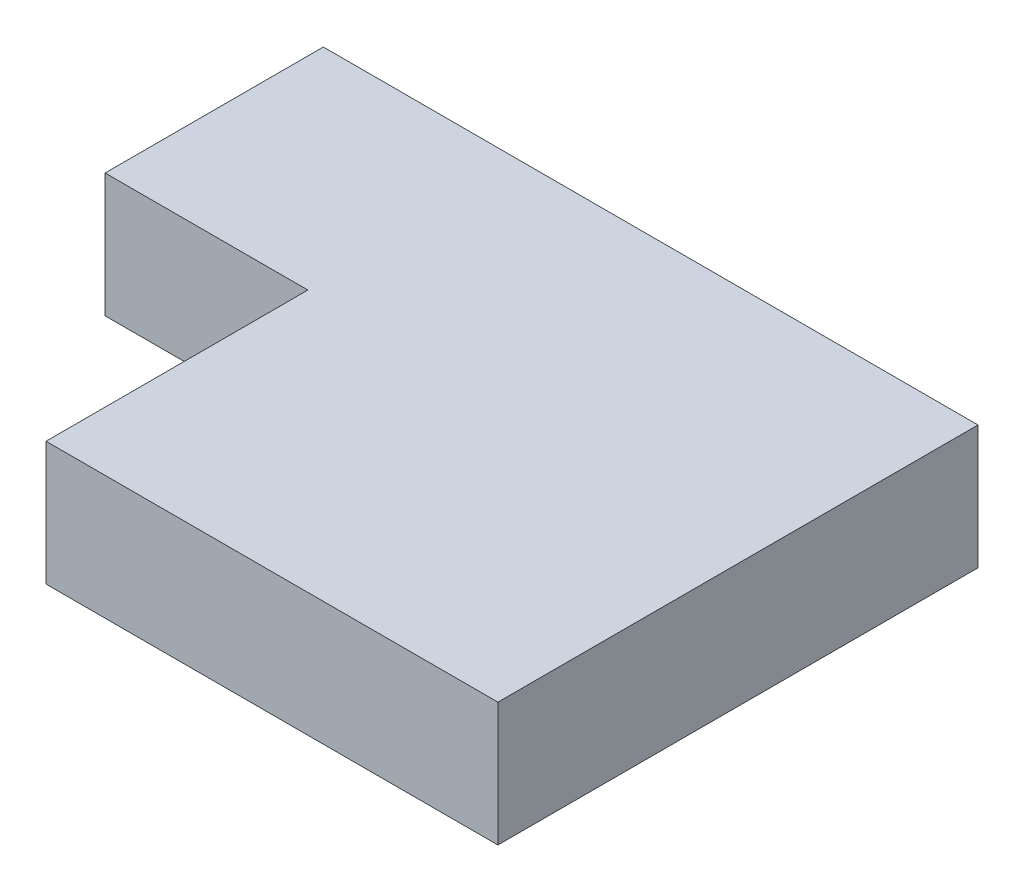
ISO-10303-21;
HEADER;
FILE_DESCRIPTION(('STEP AP214'),'2;1');
FILE_NAME('part.step','',(''),(''),'','','');
FILE_SCHEMA(('AUTOMOTIVE_DESIGN { 1 0 10303 214 1 1 1 1 }'));
ENDSEC;
DATA;
#1=APPLICATION_CONTEXT('core data for automotive mechanical design processes');
#2=APPLICATION_PROTOCOL_DEFINITION('international standard','automotive_design',2000,#1);
#3=PRODUCT_CONTEXT('',#1,'mechanical');
#4=PRODUCT('Part','Part','',(#3));
#5=PRODUCT_RELATED_PRODUCT_CATEGORY('part','',(#4));
#6=PRODUCT_DEFINITION_FORMATION('','',#4);
#7=PRODUCT_DEFINITION_CONTEXT('part definition',#1,'design');
#8=PRODUCT_DEFINITION('design','',#6,#7);
#9=PRODUCT_DEFINITION_SHAPE('','',#8);
#10=(LENGTH_UNIT() NAMED_UNIT(*) SI_UNIT(.MILLI.,.METRE.));
#11=(NAMED_UNIT(*) PLANE_ANGLE_UNIT() SI_UNIT($,.RADIAN.));
#12=(NAMED_UNIT(*) SI_UNIT($,.STERADIAN.) SOLID_ANGLE_UNIT());
#13=UNCERTAINTY_MEASURE_WITH_UNIT(LENGTH_MEASURE(1.E-05),#10,'distance_accuracy_value','');
#14=(GEOMETRIC_REPRESENTATION_CONTEXT(3) GLOBAL_UNCERTAINTY_ASSIGNED_CONTEXT((#13)) GLOBAL_UNIT_ASSIGNED_CONTEXT((#10,
#11,#12)) REPRESENTATION_CONTEXT('',''));
#15=CARTESIAN_POINT('',(0.,0.,0.));
#16=DIRECTION('',(0.,0.,1.));
#17=DIRECTION('',(1.,0.,0.));
#18=AXIS2_PLACEMENT_3D('',#15,#16,#17);
#19=CARTESIAN_POINT('',(-58.1106407317549,4.800000052,36.0373689514569));
#20=DIRECTION('',(-1.,0.,0.));
#21=DIRECTION('',(0.,0.,1.));
#22=AXIS2_PLACEMENT_3D('',#19,#20,#21);
#23=PLANE('',#22);
#24=DIRECTION('',(0.,1.,0.));
#25=VECTOR('',#24,1.);
#26=CARTESIAN_POINT('',(-58.1106407317549,0.,29.2640356181236));
#27=LINE('',#26,#25);
#28=CARTESIAN_POINT('',(-58.1106407317549,0.,29.2640356181236));
#29=VERTEX_POINT('',#28);
#30=CARTESIAN_POINT('',(-58.1106407317549,4.800000052,29.2640356181236));
#31=VERTEX_POINT('',#30);
#32=EDGE_CURVE('E157',#29,#31,#27,.T.);
#33=ORIENTED_EDGE('',*,*,#32,.F.);
#34=DIRECTION('',(0.,0.,-1.));
#35=VECTOR('',#34,1.);
#36=CARTESIAN_POINT('',(-58.1106407317549,0.,36.0373689514569));
#37=LINE('',#36,#35);
#38=CARTESIAN_POINT('',(-58.1106407317549,0.,10.6373689514569));
#39=VERTEX_POINT('',#38);
#40=EDGE_CURVE('E140',#29,#39,#37,.T.);
#41=ORIENTED_EDGE('',*,*,#40,.T.);
#42=DIRECTION('',(0.,-1.,0.));
#43=VECTOR('',#42,1.);
#44=CARTESIAN_POINT('',(-58.1106407317549,4.800000052,10.6373689514569));
#45=LINE('',#44,#43);
#46=CARTESIAN_POINT('',(-58.1106407317549,4.800000052,10.6373689514569));
#47=VERTEX_POINT('',#46);
#48=EDGE_CURVE('E13',#47,#39,#45,.T.);
#49=ORIENTED_EDGE('',*,*,#48,.F.);
#50=DIRECTION('',(0.,0.,-1.));
#51=VECTOR('',#50,1.);
#52=CARTESIAN_POINT('',(-58.1106407317549,4.800000052,36.0373689514569));
#53=LINE('',#52,#51);
#54=EDGE_CURVE('E134',#31,#47,#53,.T.);
#55=ORIENTED_EDGE('',*,*,#54,.F.);
#56=EDGE_LOOP('',(#33,#41,#49,#55));
#57=FACE_BOUND('',#56,.T.);
#58=ADVANCED_FACE('F65',(#57),#23,.F.);
#59=CARTESIAN_POINT('',(0.,4.800000052,0.));
#60=DIRECTION('',(0.,-1.,0.));
#61=DIRECTION('',(0.,0.,-1.));
#62=AXIS2_PLACEMENT_3D('',#59,#60,#61);
#63=PLANE('',#62);
#64=DIRECTION('',(-1.,0.,0.));
#65=VECTOR('',#64,1.);
#66=CARTESIAN_POINT('',(-91.9773073984215,4.800000052,10.6373689514569));
#67=LINE('',#66,#65);
#68=CARTESIAN_POINT('',(-83.5106407317549,4.800000052,10.6373689514569));
#69=VERTEX_POINT('',#68);
#70=EDGE_CURVE('E72',#47,#69,#67,.T.);
#71=ORIENTED_EDGE('',*,*,#70,.T.);
#72=DIRECTION('',(0.,0.,1.));
#73=VECTOR('',#72,1.);
#74=CARTESIAN_POINT('',(-83.5106407317549,4.800000052,0.));
#75=LINE('',#74,#73);
#76=CARTESIAN_POINT('',(-83.5106407317549,4.800000052,19.1040356181236));
#77=VERTEX_POINT('',#76);
#78=EDGE_CURVE('E115',#69,#77,#75,.T.);
#79=ORIENTED_EDGE('',*,*,#78,.T.);
#80=DIRECTION('',(-1.,0.,0.));
#81=VECTOR('',#80,1.);
#82=CARTESIAN_POINT('',(-91.9773073984215,4.800000052,19.1040356181236));
#83=LINE('',#82,#81);
#84=CARTESIAN_POINT('',(-75.6439738810882,4.800000052,19.1040356181236));
#85=VERTEX_POINT('',#84);
#86=EDGE_CURVE('E154',#85,#77,#83,.T.);
#87=ORIENTED_EDGE('',*,*,#86,.F.);
#88=DIRECTION('',(0.,0.,-1.));
#89=VECTOR('',#88,1.);
#90=CARTESIAN_POINT('',(-75.6439738810882,4.800000052,36.0373689514569));
#91=LINE('',#90,#89);
#92=CARTESIAN_POINT('',(-75.6439738810882,4.800000052,29.2640356181236));
#93=VERTEX_POINT('',#92);
#94=EDGE_CURVE('E156',#93,#85,#91,.T.);
#95=ORIENTED_EDGE('',*,*,#94,.F.);
#96=DIRECTION('',(1.,0.,0.));
#97=VECTOR('',#96,1.);
#98=CARTESIAN_POINT('',(0.,4.800000052,29.2640356181235));
#99=LINE('',#98,#97);
#100=EDGE_CURVE('E87',#93,#31,#99,.T.);
#101=ORIENTED_EDGE('',*,*,#100,.T.);
#102=ORIENTED_EDGE('',*,*,#54,.T.);
#103=EDGE_LOOP('',(#71,#79,#87,#95,#101,#102));
#104=FACE_BOUND('',#103,.T.);
#105=ADVANCED_FACE('F132',(#104),#63,.F.);
#106=CARTESIAN_POINT('',(0.,0.,0.));
#107=DIRECTION('',(0.,-1.,0.));
#108=DIRECTION('',(0.,0.,-1.));
#109=AXIS2_PLACEMENT_3D('',#106,#107,#108);
#110=PLANE('',#109);
#111=DIRECTION('',(0.,0.,1.));
#112=VECTOR('',#111,1.);
#113=CARTESIAN_POINT('',(-83.5106407317549,0.,0.));
#114=LINE('',#113,#112);
#115=CARTESIAN_POINT('',(-83.5106407317549,0.,10.6373689514569));
#116=VERTEX_POINT('',#115);
#117=CARTESIAN_POINT('',(-83.5106407317549,0.,19.1040356181236));
#118=VERTEX_POINT('',#117);
#119=EDGE_CURVE('E79',#116,#118,#114,.T.);
#120=ORIENTED_EDGE('',*,*,#119,.F.);
#121=DIRECTION('',(-1.,0.,0.));
#122=VECTOR('',#121,1.);
#123=CARTESIAN_POINT('',(-91.9773073984215,0.,10.6373689514569));
#124=LINE('',#123,#122);
#125=EDGE_CURVE('E130',#39,#116,#124,.T.);
#126=ORIENTED_EDGE('',*,*,#125,.F.);
#127=ORIENTED_EDGE('',*,*,#40,.F.);
#128=DIRECTION('',(1.,0.,0.));
#129=VECTOR('',#128,1.);
#130=CARTESIAN_POINT('',(0.,0.,29.2640356181235));
#131=LINE('',#130,#129);
#132=CARTESIAN_POINT('',(-75.6439738810882,0.,29.2640356181236));
#133=VERTEX_POINT('',#132);
#134=EDGE_CURVE('E162',#133,#29,#131,.T.);
#135=ORIENTED_EDGE('',*,*,#134,.F.);
#136=DIRECTION('',(0.,0.,-1.));
#137=VECTOR('',#136,1.);
#138=CARTESIAN_POINT('',(-75.6439738810882,0.,36.0373689514569));
#139=LINE('',#138,#137);
#140=CARTESIAN_POINT('',(-75.6439738810882,0.,19.1040356181236));
#141=VERTEX_POINT('',#140);
#142=EDGE_CURVE('E151',#133,#141,#139,.T.);
#143=ORIENTED_EDGE('',*,*,#142,.T.);
#144=DIRECTION('',(-1.,0.,0.));
#145=VECTOR('',#144,1.);
#146=CARTESIAN_POINT('',(-91.9773073984215,0.,19.1040356181236));
#147=LINE('',#146,#145);
#148=EDGE_CURVE('E146',#141,#118,#147,.T.);
#149=ORIENTED_EDGE('',*,*,#148,.T.);
#150=EDGE_LOOP('',(#120,#126,#127,#135,#143,#149));
#151=FACE_BOUND('',#150,.T.);
#152=ADVANCED_FACE('F169',(#151),#110,.T.);
#153=CARTESIAN_POINT('',(-75.6439738810882,0.,36.0373689514569));
#154=DIRECTION('',(1.,0.,0.));
#155=DIRECTION('',(0.,0.,-1.));
#156=AXIS2_PLACEMENT_3D('',#153,#154,#155);
#157=PLANE('',#156);
#158=DIRECTION('',(0.,1.,0.));
#159=VECTOR('',#158,1.);
#160=CARTESIAN_POINT('',(-75.6439738810882,0.,29.2640356181236));
#161=LINE('',#160,#159);
#162=EDGE_CURVE('E160',#133,#93,#161,.T.);
#163=ORIENTED_EDGE('',*,*,#162,.T.);
#164=ORIENTED_EDGE('',*,*,#94,.T.);
#165=DIRECTION('',(0.,1.,0.));
#166=VECTOR('',#165,1.);
#167=CARTESIAN_POINT('',(-75.6439738810882,0.,19.1040356181236));
#168=LINE('',#167,#166);
#169=EDGE_CURVE('E141',#141,#85,#168,.T.);
#170=ORIENTED_EDGE('',*,*,#169,.F.);
#171=ORIENTED_EDGE('',*,*,#142,.F.);
#172=EDGE_LOOP('',(#163,#164,#170,#171));
#173=FACE_BOUND('',#172,.T.);
#174=ADVANCED_FACE('F173',(#173),#157,.F.);
#175=CARTESIAN_POINT('',(-91.9773073984215,4.800000052,10.6373689514569));
#176=DIRECTION('',(0.,0.,1.));
#177=DIRECTION('',(1.,0.,0.));
#178=AXIS2_PLACEMENT_3D('',#175,#176,#177);
#179=PLANE('',#178);
#180=ORIENTED_EDGE('',*,*,#125,.T.);
#181=DIRECTION('',(0.,-1.,0.));
#182=VECTOR('',#181,1.);
#183=CARTESIAN_POINT('',(-83.5106407317549,4.800000052,10.6373689514569));
#184=LINE('',#183,#182);
#185=EDGE_CURVE('E118',#69,#116,#184,.T.);
#186=ORIENTED_EDGE('',*,*,#185,.F.);
#187=ORIENTED_EDGE('',*,*,#70,.F.);
#188=ORIENTED_EDGE('',*,*,#48,.T.);
#189=EDGE_LOOP('',(#180,#186,#187,#188));
#190=FACE_BOUND('',#189,.T.);
#191=ADVANCED_FACE('F128',(#190),#179,.F.);
#192=CARTESIAN_POINT('',(-91.9773073984215,0.,19.1040356181236));
#193=DIRECTION('',(0.,0.,-1.));
#194=DIRECTION('',(-1.,0.,0.));
#195=AXIS2_PLACEMENT_3D('',#192,#193,#194);
#196=PLANE('',#195);
#197=ORIENTED_EDGE('',*,*,#86,.T.);
#198=DIRECTION('',(0.,-1.,0.));
#199=VECTOR('',#198,1.);
#200=CARTESIAN_POINT('',(-83.5106407317549,4.800000052,19.1040356181236));
#201=LINE('',#200,#199);
#202=EDGE_CURVE('E119',#77,#118,#201,.T.);
#203=ORIENTED_EDGE('',*,*,#202,.T.);
#204=ORIENTED_EDGE('',*,*,#148,.F.);
#205=ORIENTED_EDGE('',*,*,#169,.T.);
#206=EDGE_LOOP('',(#197,#203,#204,#205));
#207=FACE_BOUND('',#206,.T.);
#208=ADVANCED_FACE('F167',(#207),#196,.F.);
#209=CARTESIAN_POINT('',(0.,0.,29.2640356181235));
#210=DIRECTION('',(0.,0.,1.));
#211=DIRECTION('',(1.,0.,0.));
#212=AXIS2_PLACEMENT_3D('',#209,#210,#211);
#213=PLANE('',#212);
#214=ORIENTED_EDGE('',*,*,#100,.F.);
#215=ORIENTED_EDGE('',*,*,#162,.F.);
#216=ORIENTED_EDGE('',*,*,#134,.T.);
#217=ORIENTED_EDGE('',*,*,#32,.T.);
#218=EDGE_LOOP('',(#214,#215,#216,#217));
#219=FACE_BOUND('',#218,.T.);
#220=ADVANCED_FACE('F175',(#219),#213,.T.);
#221=CARTESIAN_POINT('',(-83.5106407317549,4.800000052,0.));
#222=DIRECTION('',(1.,0.,0.));
#223=DIRECTION('',(0.,0.,-1.));
#224=AXIS2_PLACEMENT_3D('',#221,#222,#223);
#225=PLANE('',#224);
#226=ORIENTED_EDGE('',*,*,#119,.T.);
#227=ORIENTED_EDGE('',*,*,#202,.F.);
#228=ORIENTED_EDGE('',*,*,#78,.F.);
#229=ORIENTED_EDGE('',*,*,#185,.T.);
#230=EDGE_LOOP('',(#226,#227,#228,#229));
#231=FACE_BOUND('',#230,.T.);
#232=ADVANCED_FACE('F117',(#231),#225,.F.);
#233=CLOSED_SHELL('',(#58,#105,#152,#174,#191,#208,#220,#232));
#234=MANIFOLD_SOLID_BREP('B2',#233);
#235=ADVANCED_BREP_SHAPE_REPRESENTATION('',(#18,#234),#14);
#236=SHAPE_DEFINITION_REPRESENTATION(#9,#235);
ENDSEC;
END-ISO-10303-21;
